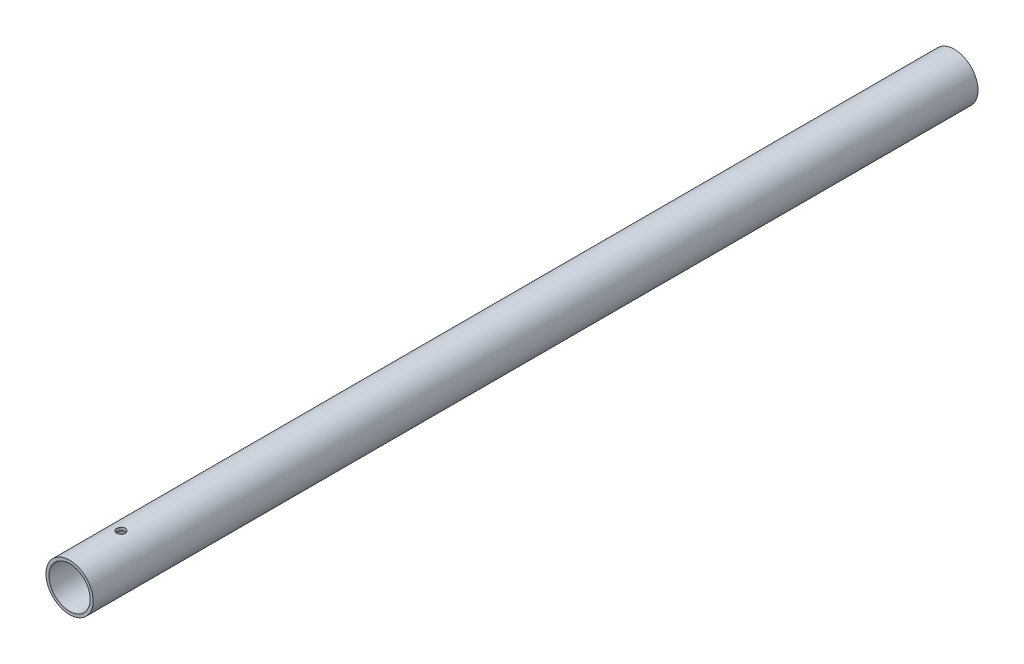
ISO-10303-21;
HEADER;
FILE_DESCRIPTION(('STEP AP214'),'2;1');
FILE_NAME('part.step','',(''),(''),'','','');
FILE_SCHEMA(('AUTOMOTIVE_DESIGN { 1 0 10303 214 1 1 1 1 }'));
ENDSEC;
DATA;
#1=APPLICATION_CONTEXT('core data for automotive mechanical design processes');
#2=APPLICATION_PROTOCOL_DEFINITION('international standard','automotive_design',2000,#1);
#3=PRODUCT_CONTEXT('',#1,'mechanical');
#4=PRODUCT('Part','Part','',(#3));
#5=PRODUCT_RELATED_PRODUCT_CATEGORY('part','',(#4));
#6=PRODUCT_DEFINITION_FORMATION('','',#4);
#7=PRODUCT_DEFINITION_CONTEXT('part definition',#1,'design');
#8=PRODUCT_DEFINITION('design','',#6,#7);
#9=PRODUCT_DEFINITION_SHAPE('','',#8);
#10=(LENGTH_UNIT() NAMED_UNIT(*) SI_UNIT(.MILLI.,.METRE.));
#11=(NAMED_UNIT(*) PLANE_ANGLE_UNIT() SI_UNIT($,.RADIAN.));
#12=(NAMED_UNIT(*) SI_UNIT($,.STERADIAN.) SOLID_ANGLE_UNIT());
#13=UNCERTAINTY_MEASURE_WITH_UNIT(LENGTH_MEASURE(1.E-05),#10,'distance_accuracy_value','');
#14=(GEOMETRIC_REPRESENTATION_CONTEXT(3) GLOBAL_UNCERTAINTY_ASSIGNED_CONTEXT((#13)) GLOBAL_UNIT_ASSIGNED_CONTEXT((#10,
#11,#12)) REPRESENTATION_CONTEXT('',''));
#15=CARTESIAN_POINT('',(0.,0.,0.));
#16=DIRECTION('',(0.,0.,1.));
#17=DIRECTION('',(1.,0.,0.));
#18=AXIS2_PLACEMENT_3D('',#15,#16,#17);
#19=CARTESIAN_POINT('',(0.,0.,300.));
#20=DIRECTION('',(0.,0.,1.));
#21=DIRECTION('',(1.,0.,0.));
#22=AXIS2_PLACEMENT_3D('',#19,#20,#21);
#23=PLANE('',#22);
#24=CARTESIAN_POINT('',(0.,0.,300.));
#25=DIRECTION('',(0.,0.,1.));
#26=DIRECTION('',(1.,0.,0.));
#27=AXIS2_PLACEMENT_3D('',#24,#25,#26);
#28=CIRCLE('',#27,8.);
#29=CARTESIAN_POINT('',(8.,0.,300.));
#30=VERTEX_POINT('',#29);
#31=EDGE_CURVE('E57',#30,#30,#28,.T.);
#32=ORIENTED_EDGE('',*,*,#31,.T.);
#33=EDGE_LOOP('',(#32));
#34=FACE_BOUND('',#33,.T.);
#35=CARTESIAN_POINT('',(0.,0.,300.));
#36=DIRECTION('',(0.,0.,1.));
#37=DIRECTION('',(1.,0.,0.));
#38=AXIS2_PLACEMENT_3D('',#35,#36,#37);
#39=CIRCLE('',#38,7.);
#40=CARTESIAN_POINT('',(7.,0.,300.));
#41=VERTEX_POINT('',#40);
#42=EDGE_CURVE('E96',#41,#41,#39,.T.);
#43=ORIENTED_EDGE('',*,*,#42,.F.);
#44=EDGE_LOOP('',(#43));
#45=FACE_BOUND('',#44,.T.);
#46=ADVANCED_FACE('F39',(#34,#45),#23,.T.);
#47=CARTESIAN_POINT('',(0.,0.,0.));
#48=DIRECTION('',(0.,0.,1.));
#49=DIRECTION('',(1.,0.,0.));
#50=AXIS2_PLACEMENT_3D('',#47,#48,#49);
#51=PLANE('',#50);
#52=CARTESIAN_POINT('',(0.,0.,0.));
#53=DIRECTION('',(0.,0.,1.));
#54=DIRECTION('',(1.,0.,0.));
#55=AXIS2_PLACEMENT_3D('',#52,#53,#54);
#56=CIRCLE('',#55,8.);
#57=CARTESIAN_POINT('',(8.,0.,0.));
#58=VERTEX_POINT('',#57);
#59=EDGE_CURVE('E62',#58,#58,#56,.T.);
#60=ORIENTED_EDGE('',*,*,#59,.F.);
#61=EDGE_LOOP('',(#60));
#62=FACE_BOUND('',#61,.T.);
#63=CARTESIAN_POINT('',(0.,0.,0.));
#64=DIRECTION('',(0.,0.,1.));
#65=DIRECTION('',(1.,0.,0.));
#66=AXIS2_PLACEMENT_3D('',#63,#64,#65);
#67=CIRCLE('',#66,7.);
#68=CARTESIAN_POINT('',(7.,0.,0.));
#69=VERTEX_POINT('',#68);
#70=EDGE_CURVE('E95',#69,#69,#67,.T.);
#71=ORIENTED_EDGE('',*,*,#70,.T.);
#72=EDGE_LOOP('',(#71));
#73=FACE_BOUND('',#72,.T.);
#74=ADVANCED_FACE('F104',(#62,#73),#51,.F.);
#75=CARTESIAN_POINT('',(0.,0.,300.));
#76=DIRECTION('',(0.,0.,-1.));
#77=DIRECTION('',(-1.,0.,0.));
#78=AXIS2_PLACEMENT_3D('',#75,#76,#77);
#79=CYLINDRICAL_SURFACE('',#78,8.);
#80=CARTESIAN_POINT('',(0.,-8.,284.05));
#81=CARTESIAN_POINT('',(0.0807384168234227,-7.99999855711492,284.049996864394));
#82=CARTESIAN_POINT('',(0.161518203029464,-7.99876509049859,284.043233739353));
#83=CARTESIAN_POINT('',(0.320804782772893,-7.9939633998169,284.016375421471));
#84=CARTESIAN_POINT('',(0.399309542630493,-7.99039315024603,283.99626866226));
#85=CARTESIAN_POINT('',(0.551719111767331,-7.98131760656955,283.943356221937));
#86=CARTESIAN_POINT('',(0.62562788827448,-7.97581400939515,283.910561674557));
#87=CARTESIAN_POINT('',(0.766886478728523,-7.96347404674392,283.833235435557));
#88=CARTESIAN_POINT('',(0.834236890617204,-7.9566378029386,283.788704815316));
#89=CARTESIAN_POINT('',(0.961230528069861,-7.94230232780297,283.688639557807));
#90=CARTESIAN_POINT('',(1.02078947767733,-7.93479712298762,283.632998809827));
#91=CARTESIAN_POINT('',(1.12978079245367,-7.92001437127186,283.512521047));
#92=CARTESIAN_POINT('',(1.17921245876536,-7.91273684011195,283.44768339802));
#93=CARTESIAN_POINT('',(1.26689260060321,-7.89917544937294,283.310061889721));
#94=CARTESIAN_POINT('',(1.30505608656449,-7.89289929776914,283.237223056418));
#95=CARTESIAN_POINT('',(1.36857266110055,-7.88213507076236,283.086035293155));
#96=CARTESIAN_POINT('',(1.39392677892338,-7.87764685170301,283.007686806478));
#97=CARTESIAN_POINT('',(1.43083595475152,-7.87102659917878,282.848602985755));
#98=CARTESIAN_POINT('',(1.44253754065478,-7.86886956478164,282.767902708501));
#99=CARTESIAN_POINT('',(1.4522641471114,-7.86708046082951,282.60565762305));
#100=CARTESIAN_POINT('',(1.45029031293551,-7.86744817983484,282.524112886145));
#101=CARTESIAN_POINT('',(1.43284109082216,-7.87064425220334,282.363550316091));
#102=CARTESIAN_POINT('',(1.41753168809445,-7.87344235385139,282.284513753699));
#103=CARTESIAN_POINT('',(1.37410702319918,-7.88113645094699,282.130149817965));
#104=CARTESIAN_POINT('',(1.34599124934181,-7.88603253022063,282.054822592966));
#105=CARTESIAN_POINT('',(1.27758777101004,-7.8974028718839,281.909526431677));
#106=CARTESIAN_POINT('',(1.2372324526172,-7.90388586131609,281.839590038219));
#107=CARTESIAN_POINT('',(1.14554329981398,-7.91769369687744,281.707418820283));
#108=CARTESIAN_POINT('',(1.09420842202846,-7.92501862298427,281.645184728632));
#109=CARTESIAN_POINT('',(0.981119488893061,-7.93981716356006,281.529225125709));
#110=CARTESIAN_POINT('',(0.919223320820373,-7.947291380577,281.475638189518));
#111=CARTESIAN_POINT('',(0.787245929686067,-7.96144718346701,281.379588325244));
#112=CARTESIAN_POINT('',(0.717164634446775,-7.96812876234942,281.337125495266));
#113=CARTESIAN_POINT('',(0.570666241716283,-7.97995863477376,281.264511242861));
#114=CARTESIAN_POINT('',(0.494242189626404,-7.98510521608114,281.234373554887));
#115=CARTESIAN_POINT('',(0.337302535747967,-7.99327184080502,281.187401585601));
#116=CARTESIAN_POINT('',(0.256787340526234,-7.99629209508878,281.170565985105));
#117=CARTESIAN_POINT('',(0.095143815028628,-7.99983699102841,281.150867403795));
#118=CARTESIAN_POINT('',(0.0140393560781089,-8.00039556220426,281.147814441659));
#119=CARTESIAN_POINT('',(-0.147521420048101,-7.99904763243993,281.155259163238));
#120=CARTESIAN_POINT('',(-0.227977766730015,-7.997141244366,281.16575622652));
#121=CARTESIAN_POINT('',(-0.385360780150288,-7.99109868648559,281.199845044508));
#122=CARTESIAN_POINT('',(-0.462308807440198,-7.98697878218855,281.223341314542));
#123=CARTESIAN_POINT('',(-0.611173476743302,-7.97696921908575,281.282658725234));
#124=CARTESIAN_POINT('',(-0.683089794550452,-7.97107944637202,281.318480659186));
#125=CARTESIAN_POINT('',(-0.820664915616791,-7.95809888753131,281.401857579231));
#126=CARTESIAN_POINT('',(-0.886251746357825,-7.95099637108971,281.449529459835));
#127=CARTESIAN_POINT('',(-1.00856278067931,-7.93640989650367,281.555094055752));
#128=CARTESIAN_POINT('',(-1.06528621373945,-7.92892590527148,281.612987658737));
#129=CARTESIAN_POINT('',(-1.16897670385415,-7.91430829115979,281.738209974989));
#130=CARTESIAN_POINT('',(-1.21581450012393,-7.90718014246468,281.805646466398));
#131=CARTESIAN_POINT('',(-1.29749725361189,-7.89418891323489,281.94754185664));
#132=CARTESIAN_POINT('',(-1.33234263775491,-7.8883257876687,282.022000505366));
#133=CARTESIAN_POINT('',(-1.38886500670449,-7.87857082899044,282.175488093918));
#134=CARTESIAN_POINT('',(-1.41060282081407,-7.87466990395996,282.254494028562));
#135=CARTESIAN_POINT('',(-1.44048187516075,-7.86925959519111,282.415113610352));
#136=CARTESIAN_POINT('',(-1.44862453791815,-7.86774996124231,282.49672698376));
#137=CARTESIAN_POINT('',(-1.45103699837205,-7.86730526599662,282.658951287718));
#138=CARTESIAN_POINT('',(-1.44551054413901,-7.86833239212088,282.7395591557));
#139=CARTESIAN_POINT('',(-1.42118600391508,-7.87276194454811,282.898676969441));
#140=CARTESIAN_POINT('',(-1.40238798517159,-7.87616435881542,282.977186925826));
#141=CARTESIAN_POINT('',(-1.35213747052832,-7.88494567612137,283.129780288556));
#142=CARTESIAN_POINT('',(-1.32070563533443,-7.89032135095005,283.203870696323));
#143=CARTESIAN_POINT('',(-1.24610154534254,-7.90244600960305,283.34575921494));
#144=CARTESIAN_POINT('',(-1.2029285368857,-7.90919508157792,283.413556921489));
#145=CARTESIAN_POINT('',(-1.10535337918192,-7.92342424931987,283.541958915034));
#146=CARTESIAN_POINT('',(-1.05080242837475,-7.93091325960403,283.602449155447));
#147=CARTESIAN_POINT('',(-0.93233141624773,-7.94571044164199,283.713485662655));
#148=CARTESIAN_POINT('',(-0.868409203847938,-7.95301857142509,283.764029640128));
#149=CARTESIAN_POINT('',(-0.732373457191765,-7.96670175025597,283.854129856623));
#150=CARTESIAN_POINT('',(-0.660196116623759,-7.97306851844026,283.893591047159));
#151=CARTESIAN_POINT('',(-0.510146088074328,-7.98407092348129,283.959765156424));
#152=CARTESIAN_POINT('',(-0.432278933836096,-7.98870821626546,283.986490276456));
#153=CARTESIAN_POINT('',(-0.295132428700114,-7.99476282370486,284.020889586063));
#154=CARTESIAN_POINT('',(-0.236664063218219,-7.99671586095906,284.031787706975));
#155=CARTESIAN_POINT('',(-0.118804585232492,-7.99933496541903,284.04634398563));
#156=CARTESIAN_POINT('',(-0.0594134936670531,-8.00000106178505,284.050002307418));
#157=CARTESIAN_POINT('',(0.,-8.,284.05));
#158=B_SPLINE_CURVE_WITH_KNOTS('',3,(#80,#81,#82,#83,#84,#85,#86,#87,#88,#89,#90,#91,#92,#93,
#94,#95,#96,#97,#98,#99,#100,#101,#102,#103,#104,#105,#106,#107,#108,#109,#110,#111,#112,#113,
#114,#115,#116,#117,#118,#119,#120,#121,#122,#123,#124,#125,#126,#127,#128,#129,#130,#131,#132,
#133,#134,#135,#136,#137,#138,#139,#140,#141,#142,#143,#144,#145,#146,#147,#148,#149,#150,#151,
#152,#153,#154,#155,#156,#157),.UNSPECIFIED.,.T.,.F.,(4,2,2,2,2,2,2,2,2,2,2,2,2,2,2,2,2,2,2,2,2,
2,2,2,2,2,2,2,2,2,2,2,2,2,2,2,2,2,4),(0.,0.241998005083904,0.484206050469171,0.726202034835234,
0.968175935150463,1.21258210508712,1.4570051351739,1.70322719237314,1.94942946218774,
2.19296428672088,2.43647871627251,2.67700479284047,2.91754048068238,3.15942992047404,
3.40134235696741,3.64681209460557,3.89228399699603,4.13802869911063,4.3837490273581,
4.62607176898316,4.8683834154572,5.10893836825512,5.34950880638363,5.59255371621671,
5.83561974289251,6.08169020422235,6.32775190464074,6.57266271856356,6.81754790478774,
7.05880495959785,7.30006079196019,7.54092368157351,7.78180203568166,8.02605402091782,
8.2703621598073,8.51670566292769,8.76281268933123,8.94089733977538,9.11897795502867),.UNSPECIFIED.);
#159=CARTESIAN_POINT('',(0.,-8.,284.05));
#160=VERTEX_POINT('',#159);
#161=EDGE_CURVE('E10',#160,#160,#158,.T.);
#162=ORIENTED_EDGE('',*,*,#161,.T.);
#163=EDGE_LOOP('',(#162));
#164=FACE_BOUND('',#163,.T.);
#165=CARTESIAN_POINT('',(0.,8.,284.05));
#166=CARTESIAN_POINT('',(-0.0807384168234225,7.99999855711492,284.049996864394));
#167=CARTESIAN_POINT('',(-0.161518203029464,7.99876509049859,284.043233739353));
#168=CARTESIAN_POINT('',(-0.320804782772893,7.9939633998169,284.016375421471));
#169=CARTESIAN_POINT('',(-0.399309542630495,7.99039315024603,283.99626866226));
#170=CARTESIAN_POINT('',(-0.551719111767323,7.98131760656955,283.943356221937));
#171=CARTESIAN_POINT('',(-0.625627888274462,7.97581400939515,283.910561674557));
#172=CARTESIAN_POINT('',(-0.766886478728507,7.96347404674393,283.833235435557));
#173=CARTESIAN_POINT('',(-0.834236890617197,7.9566378029386,283.788704815316));
#174=CARTESIAN_POINT('',(-0.961230528069862,7.94230232780297,283.688639557807));
#175=CARTESIAN_POINT('',(-1.02078947767733,7.93479712298762,283.632998809827));
#176=CARTESIAN_POINT('',(-1.12978079245367,7.92001437127186,283.512521047));
#177=CARTESIAN_POINT('',(-1.17921245876536,7.91273684011195,283.44768339802));
#178=CARTESIAN_POINT('',(-1.26689260060321,7.89917544937294,283.310061889721));
#179=CARTESIAN_POINT('',(-1.30505608656449,7.89289929776914,283.237223056418));
#180=CARTESIAN_POINT('',(-1.36857266110055,7.88213507076237,283.086035293155));
#181=CARTESIAN_POINT('',(-1.39392677892338,7.87764685170301,283.007686806478));
#182=CARTESIAN_POINT('',(-1.43083595475152,7.87102659917878,282.848602985755));
#183=CARTESIAN_POINT('',(-1.44253754065478,7.86886956478164,282.767902708501));
#184=CARTESIAN_POINT('',(-1.4522641471114,7.86708046082951,282.60565762305));
#185=CARTESIAN_POINT('',(-1.45029031293551,7.86744817983483,282.524112886145));
#186=CARTESIAN_POINT('',(-1.43284109082216,7.87064425220334,282.363550316091));
#187=CARTESIAN_POINT('',(-1.41753168809445,7.87344235385139,282.284513753699));
#188=CARTESIAN_POINT('',(-1.37410702319918,7.88113645094699,282.130149817965));
#189=CARTESIAN_POINT('',(-1.34599124934181,7.88603253022063,282.054822592966));
#190=CARTESIAN_POINT('',(-1.27758777101004,7.8974028718839,281.909526431677));
#191=CARTESIAN_POINT('',(-1.2372324526172,7.90388586131609,281.839590038219));
#192=CARTESIAN_POINT('',(-1.14554329981398,7.91769369687744,281.707418820283));
#193=CARTESIAN_POINT('',(-1.09420842202846,7.92501862298427,281.645184728632));
#194=CARTESIAN_POINT('',(-0.981119488893061,7.93981716356006,281.529225125709));
#195=CARTESIAN_POINT('',(-0.919223320820373,7.947291380577,281.475638189518));
#196=CARTESIAN_POINT('',(-0.787245929686067,7.96144718346701,281.379588325244));
#197=CARTESIAN_POINT('',(-0.717164634446775,7.96812876234942,281.337125495266));
#198=CARTESIAN_POINT('',(-0.570666241716283,7.97995863477376,281.264511242861));
#199=CARTESIAN_POINT('',(-0.494242189626404,7.98510521608114,281.234373554887));
#200=CARTESIAN_POINT('',(-0.337302535747967,7.99327184080502,281.187401585601));
#201=CARTESIAN_POINT('',(-0.256787340526234,7.99629209508878,281.170565985105));
#202=CARTESIAN_POINT('',(-0.0951438150286283,7.99983699102841,281.150867403795));
#203=CARTESIAN_POINT('',(-0.0140393560781091,8.00039556220426,281.147814441659));
#204=CARTESIAN_POINT('',(0.147521420048101,7.99904763243993,281.155259163238));
#205=CARTESIAN_POINT('',(0.227977766730015,7.997141244366,281.16575622652));
#206=CARTESIAN_POINT('',(0.385360780150288,7.99109868648559,281.199845044508));
#207=CARTESIAN_POINT('',(0.462308807440198,7.98697878218855,281.223341314542));
#208=CARTESIAN_POINT('',(0.611173476743302,7.97696921908575,281.282658725234));
#209=CARTESIAN_POINT('',(0.683089794550452,7.97107944637202,281.318480659186));
#210=CARTESIAN_POINT('',(0.820664915616791,7.95809888753131,281.401857579231));
#211=CARTESIAN_POINT('',(0.886251746357825,7.95099637108971,281.449529459835));
#212=CARTESIAN_POINT('',(1.00856278067931,7.93640989650367,281.555094055752));
#213=CARTESIAN_POINT('',(1.06528621373945,7.92892590527148,281.612987658737));
#214=CARTESIAN_POINT('',(1.16897670385415,7.91430829115979,281.738209974989));
#215=CARTESIAN_POINT('',(1.21581450012393,7.90718014246468,281.805646466398));
#216=CARTESIAN_POINT('',(1.29749725361189,7.89418891323489,281.94754185664));
#217=CARTESIAN_POINT('',(1.33234263775491,7.8883257876687,282.022000505366));
#218=CARTESIAN_POINT('',(1.38886500670449,7.87857082899044,282.175488093918));
#219=CARTESIAN_POINT('',(1.41060282081407,7.87466990395996,282.254494028562));
#220=CARTESIAN_POINT('',(1.44048187516075,7.86925959519111,282.415113610352));
#221=CARTESIAN_POINT('',(1.44862453791815,7.86774996124231,282.49672698376));
#222=CARTESIAN_POINT('',(1.45103699837205,7.86730526599662,282.658951287718));
#223=CARTESIAN_POINT('',(1.44551054413901,7.86833239212088,282.7395591557));
#224=CARTESIAN_POINT('',(1.42118600391508,7.87276194454811,282.898676969441));
#225=CARTESIAN_POINT('',(1.40238798517159,7.87616435881542,282.977186925826));
#226=CARTESIAN_POINT('',(1.35213747052832,7.88494567612137,283.129780288556));
#227=CARTESIAN_POINT('',(1.32070563533443,7.89032135095005,283.203870696323));
#228=CARTESIAN_POINT('',(1.24610154534254,7.90244600960305,283.34575921494));
#229=CARTESIAN_POINT('',(1.2029285368857,7.90919508157792,283.413556921489));
#230=CARTESIAN_POINT('',(1.10535337918192,7.92342424931987,283.541958915034));
#231=CARTESIAN_POINT('',(1.05080242837475,7.93091325960403,283.602449155447));
#232=CARTESIAN_POINT('',(0.93233141624773,7.94571044164199,283.713485662655));
#233=CARTESIAN_POINT('',(0.868409203847938,7.95301857142509,283.764029640128));
#234=CARTESIAN_POINT('',(0.732373457191765,7.96670175025597,283.854129856623));
#235=CARTESIAN_POINT('',(0.660196116623759,7.97306851844026,283.893591047159));
#236=CARTESIAN_POINT('',(0.510146088074328,7.98407092348129,283.959765156424));
#237=CARTESIAN_POINT('',(0.432278933836096,7.98870821626546,283.986490276456));
#238=CARTESIAN_POINT('',(0.295132428700114,7.99476282370485,284.020889586063));
#239=CARTESIAN_POINT('',(0.236664063218219,7.99671586095906,284.031787706975));
#240=CARTESIAN_POINT('',(0.118804585232492,7.99933496541903,284.04634398563));
#241=CARTESIAN_POINT('',(0.059413493667053,8.00000106178505,284.050002307418));
#242=CARTESIAN_POINT('',(0.,8.,284.05));
#243=B_SPLINE_CURVE_WITH_KNOTS('',3,(#165,#166,#167,#168,#169,#170,#171,#172,#173,#174,#175,
#176,#177,#178,#179,#180,#181,#182,#183,#184,#185,#186,#187,#188,#189,#190,#191,#192,#193,#194,
#195,#196,#197,#198,#199,#200,#201,#202,#203,#204,#205,#206,#207,#208,#209,#210,#211,#212,#213,
#214,#215,#216,#217,#218,#219,#220,#221,#222,#223,#224,#225,#226,#227,#228,#229,#230,#231,#232,
#233,#234,#235,#236,#237,#238,#239,#240,#241,#242),.UNSPECIFIED.,.T.,.F.,(4,2,2,2,2,2,2,2,2,2,2,
2,2,2,2,2,2,2,2,2,2,2,2,2,2,2,2,2,2,2,2,2,2,2,2,2,2,2,4),(0.,0.241998005083904,
0.484206050469171,0.726202034835212,0.968175935150461,1.21258210508712,1.45700513517389,
1.70322719237314,1.94942946218774,2.19296428672088,2.43647871627251,2.67700479284047,
2.91754048068238,3.15942992047403,3.40134235696741,3.64681209460557,3.89228399699602,
4.13802869911063,4.3837490273581,4.62607176898316,4.8683834154572,5.10893836825512,
5.34950880638363,5.5925537162167,5.83561974289251,6.08169020422235,6.32775190464074,
6.57266271856356,6.81754790478774,7.05880495959785,7.30006079196019,7.54092368157351,
7.78180203568165,8.02605402091782,8.27036215980729,8.51670566292768,8.76281268933123,
8.94089733977538,9.11897795502867),.UNSPECIFIED.);
#244=CARTESIAN_POINT('',(0.,8.,284.05));
#245=VERTEX_POINT('',#244);
#246=EDGE_CURVE('E52',#245,#245,#243,.T.);
#247=ORIENTED_EDGE('',*,*,#246,.T.);
#248=EDGE_LOOP('',(#247));
#249=FACE_BOUND('',#248,.T.);
#250=ORIENTED_EDGE('',*,*,#31,.F.);
#251=EDGE_LOOP('',(#250));
#252=FACE_BOUND('',#251,.T.);
#253=ORIENTED_EDGE('',*,*,#59,.T.);
#254=EDGE_LOOP('',(#253));
#255=FACE_BOUND('',#254,.T.);
#256=ADVANCED_FACE('F41',(#164,#249,#252,#255),#79,.T.);
#257=CARTESIAN_POINT('',(0.,0.,300.));
#258=DIRECTION('',(0.,0.,-1.));
#259=DIRECTION('',(-1.,0.,0.));
#260=AXIS2_PLACEMENT_3D('',#257,#258,#259);
#261=CYLINDRICAL_SURFACE('',#260,7.);
#262=CARTESIAN_POINT('',(0.,-7.,284.05));
#263=CARTESIAN_POINT('',(0.0805249466701699,-6.99999850989255,284.049997112581));
#264=CARTESIAN_POINT('',(0.161085782822646,-6.99859630536539,284.043269478559));
#265=CARTESIAN_POINT('',(0.31992617344772,-6.99313795170365,284.016560500689));
#266=CARTESIAN_POINT('',(0.398203935415156,-6.98907977292524,283.996569020708));
#267=CARTESIAN_POINT('',(0.55015901736692,-6.97876214021718,283.943979778004));
#268=CARTESIAN_POINT('',(0.623840809310501,-6.97250486666568,283.911394498715));
#269=CARTESIAN_POINT('',(0.764687319545304,-6.95846744810608,283.834580684827));
#270=CARTESIAN_POINT('',(0.831852343480726,-6.95068737457082,283.790352696647));
#271=CARTESIAN_POINT('',(0.958735191224268,-6.93433322717969,283.690830625646));
#272=CARTESIAN_POINT('',(1.0183451170875,-6.92575016331789,283.635400445721));
#273=CARTESIAN_POINT('',(1.12749089757001,-6.90882203110262,283.515339874854));
#274=CARTESIAN_POINT('',(1.17702592540149,-6.90047698232993,283.450708729582));
#275=CARTESIAN_POINT('',(1.26508129339265,-6.8848816514879,283.313296686548));
#276=CARTESIAN_POINT('',(1.30348874148085,-6.87764291962182,283.240442018846));
#277=CARTESIAN_POINT('',(1.36747513943071,-6.86520802025398,283.089138410899));
#278=CARTESIAN_POINT('',(1.39305545463205,-6.8600116353744,283.010690067069));
#279=CARTESIAN_POINT('',(1.43030881956003,-6.85234097622929,282.85159046977));
#280=CARTESIAN_POINT('',(1.44217182957258,-6.84982955771594,282.770985523768));
#281=CARTESIAN_POINT('',(1.45224410561838,-6.84770147594288,282.608893308868));
#282=CARTESIAN_POINT('',(1.45045487179047,-6.84808449463592,282.527406137892));
#283=CARTESIAN_POINT('',(1.43342676821931,-6.85166830695804,282.367260642511));
#284=CARTESIAN_POINT('',(1.41840673311629,-6.85482325133795,282.28857786967));
#285=CARTESIAN_POINT('',(1.37568928712309,-6.86352313010211,282.134873722447));
#286=CARTESIAN_POINT('',(1.34799123125568,-6.86906818607924,282.059852534557));
#287=CARTESIAN_POINT('',(1.28049802870707,-6.88196974503289,281.914976232658));
#288=CARTESIAN_POINT('',(1.24061711070686,-6.88933901897796,281.845162261224));
#289=CARTESIAN_POINT('',(1.14995069533808,-6.90505062197315,281.713135705791));
#290=CARTESIAN_POINT('',(1.09916385767282,-6.91339307056518,281.650924057564));
#291=CARTESIAN_POINT('',(0.986960509081247,-6.9303089640358,281.534606412996));
#292=CARTESIAN_POINT('',(0.925357477228381,-6.93888375665344,281.480680375497));
#293=CARTESIAN_POINT('',(0.793887705276948,-6.95515079073521,281.383897606444));
#294=CARTESIAN_POINT('',(0.724020843915681,-6.9628430192454,281.341041037352));
#295=CARTESIAN_POINT('',(0.577799452871655,-6.97649928617586,281.267576333351));
#296=CARTESIAN_POINT('',(0.501433722610628,-6.98246025951923,281.236989885859));
#297=CARTESIAN_POINT('',(0.344496338824663,-6.99195931104416,281.189131542233));
#298=CARTESIAN_POINT('',(0.263925234033304,-6.99549770448695,281.171857913605));
#299=CARTESIAN_POINT('',(0.102409617414456,-6.99970865003273,281.151372906149));
#300=CARTESIAN_POINT('',(0.0214975875215036,-7.00043135195801,281.147915421317));
#301=CARTESIAN_POINT('',(-0.139747949683111,-6.99906924098975,281.154496469249));
#302=CARTESIAN_POINT('',(-0.220081491699673,-6.99698459795039,281.164534185505));
#303=CARTESIAN_POINT('',(-0.377087744537933,-6.99027351051101,281.19761636639));
#304=CARTESIAN_POINT('',(-0.453788440468325,-6.98567195905928,281.220533509809));
#305=CARTESIAN_POINT('',(-0.60225802799353,-6.97444143082262,281.278584068339));
#306=CARTESIAN_POINT('',(-0.674026530001091,-6.9678122941064,281.313718447147));
#307=CARTESIAN_POINT('',(-0.811624905536874,-6.95313741331486,281.395731234301));
#308=CARTESIAN_POINT('',(-0.877365373532025,-6.94507436179468,281.442756480674));
#309=CARTESIAN_POINT('',(-1.00011039343952,-6.92846465129707,281.547020737622));
#310=CARTESIAN_POINT('',(-1.05711393417321,-6.91991793649879,281.60426092878));
#311=CARTESIAN_POINT('',(-1.16172548521281,-6.9031335571035,281.728454052886));
#312=CARTESIAN_POINT('',(-1.20916397857029,-6.89490326481206,281.795550948034));
#313=CARTESIAN_POINT('',(-1.29209855284092,-6.87984485462705,281.936904930298));
#314=CARTESIAN_POINT('',(-1.32759512839163,-6.87301667866201,282.011161720684));
#315=CARTESIAN_POINT('',(-1.38541225144555,-6.86159619967506,282.164342712475));
#316=CARTESIAN_POINT('',(-1.40780354188464,-6.85699191600111,282.243239276049));
#317=CARTESIAN_POINT('',(-1.43898654508072,-6.8505164725203,282.40378133795));
#318=CARTESIAN_POINT('',(-1.44778017803992,-6.84864492681012,282.485426446474));
#319=CARTESIAN_POINT('',(-1.45144317482413,-6.8478693742264,282.647443435895));
#320=CARTESIAN_POINT('',(-1.44658072353374,-6.84890821084664,282.727809098415));
#321=CARTESIAN_POINT('',(-1.4236643144385,-6.85370808819984,282.886549951205));
#322=CARTESIAN_POINT('',(-1.40561048016885,-6.85746910344004,282.964925160109));
#323=CARTESIAN_POINT('',(-1.35694717999705,-6.86726314204613,283.117273920146));
#324=CARTESIAN_POINT('',(-1.32637288978757,-6.87328979633686,283.191259143374));
#325=CARTESIAN_POINT('',(-1.25356831928483,-6.88693924841348,283.333091021051));
#326=CARTESIAN_POINT('',(-1.21133697195812,-6.89456219230097,283.400937112796));
#327=CARTESIAN_POINT('',(-1.11551093086308,-6.91071865839384,283.529895325694));
#328=CARTESIAN_POINT('',(-1.06172349364357,-6.91926622289806,283.590862490863));
#329=CARTESIAN_POINT('',(-0.944707390741378,-6.93621049582109,283.702994024384));
#330=CARTESIAN_POINT('',(-0.881476555137309,-6.94460716906972,283.754156133526));
#331=CARTESIAN_POINT('',(-0.74650312719802,-6.96041647836585,283.845777828524));
#332=CARTESIAN_POINT('',(-0.674671893506791,-6.96781683427348,283.886109050595));
#333=CARTESIAN_POINT('',(-0.525115847154295,-6.9806780457368,283.954063177525));
#334=CARTESIAN_POINT('',(-0.447396280793941,-6.98614060370609,283.981697243549));
#335=CARTESIAN_POINT('',(-0.307947357021847,-6.99348144016889,284.018278172815));
#336=CARTESIAN_POINT('',(-0.246997868022784,-6.99591128786898,284.030152105512));
#337=CARTESIAN_POINT('',(-0.124039325999859,-6.99917111277284,284.046013988557));
#338=CARTESIAN_POINT('',(-0.0620303113968005,-7.00000114786576,284.050002224248));
#339=CARTESIAN_POINT('',(0.,-7.,284.05));
#340=B_SPLINE_CURVE_WITH_KNOTS('',3,(#262,#263,#264,#265,#266,#267,#268,#269,#270,#271,#272,
#273,#274,#275,#276,#277,#278,#279,#280,#281,#282,#283,#284,#285,#286,#287,#288,#289,#290,#291,
#292,#293,#294,#295,#296,#297,#298,#299,#300,#301,#302,#303,#304,#305,#306,#307,#308,#309,#310,
#311,#312,#313,#314,#315,#316,#317,#318,#319,#320,#321,#322,#323,#324,#325,#326,#327,#328,#329,
#330,#331,#332,#333,#334,#335,#336,#337,#338,#339),.UNSPECIFIED.,.T.,.F.,(4,2,2,2,2,2,2,2,2,2,2,
2,2,2,2,2,2,2,2,2,2,2,2,2,2,2,2,2,2,2,2,2,2,2,2,2,2,2,4),(0.,0.241347866901649,
0.482880382833939,0.724174094429787,0.965456483586399,1.20986854684721,1.45430065948702,
1.70113209748299,1.94793725678247,2.1912820486828,2.4346001017025,2.67396773836071,
2.91334755387888,3.15445311681827,3.39558832770364,3.64138539978137,3.88718607911109,
4.13341931650588,4.37962050436621,4.62141603927576,4.86319694536795,5.10262870680993,
5.34207935895366,5.58464515465516,5.82723900283267,6.07381351285608,6.32037780843728,
6.56559856149928,6.81078468238681,7.05118957615149,7.29159221859151,7.53132404368209,
7.77107782000353,8.01519314503483,8.25936464988256,8.50631366084898,8.75304517925694,
8.9389679983145,9.12488408963691),.UNSPECIFIED.);
#341=CARTESIAN_POINT('',(0.,-7.,284.05));
#342=VERTEX_POINT('',#341);
#343=EDGE_CURVE('E88',#342,#342,#340,.T.);
#344=ORIENTED_EDGE('',*,*,#343,.F.);
#345=EDGE_LOOP('',(#344));
#346=FACE_BOUND('',#345,.T.);
#347=CARTESIAN_POINT('',(0.,7.,284.05));
#348=CARTESIAN_POINT('',(-0.0805249466701699,6.99999850989255,284.049997112581));
#349=CARTESIAN_POINT('',(-0.161085782822646,6.99859630536539,284.043269478559));
#350=CARTESIAN_POINT('',(-0.31992617344772,6.99313795170365,284.016560500689));
#351=CARTESIAN_POINT('',(-0.398203935415156,6.98907977292524,283.996569020708));
#352=CARTESIAN_POINT('',(-0.55015901736692,6.97876214021718,283.943979778004));
#353=CARTESIAN_POINT('',(-0.623840809310501,6.97250486666568,283.911394498715));
#354=CARTESIAN_POINT('',(-0.764687319545304,6.95846744810608,283.834580684827));
#355=CARTESIAN_POINT('',(-0.831852343480726,6.95068737457082,283.790352696647));
#356=CARTESIAN_POINT('',(-0.958735191224268,6.93433322717969,283.690830625646));
#357=CARTESIAN_POINT('',(-1.0183451170875,6.92575016331789,283.635400445721));
#358=CARTESIAN_POINT('',(-1.12749089757001,6.90882203110262,283.515339874854));
#359=CARTESIAN_POINT('',(-1.17702592540149,6.90047698232993,283.450708729582));
#360=CARTESIAN_POINT('',(-1.26508129339265,6.8848816514879,283.313296686548));
#361=CARTESIAN_POINT('',(-1.30348874148085,6.87764291962182,283.240442018846));
#362=CARTESIAN_POINT('',(-1.36747513943071,6.86520802025398,283.089138410899));
#363=CARTESIAN_POINT('',(-1.39305545463205,6.8600116353744,283.010690067069));
#364=CARTESIAN_POINT('',(-1.43030881956003,6.85234097622929,282.85159046977));
#365=CARTESIAN_POINT('',(-1.44217182957258,6.84982955771594,282.770985523768));
#366=CARTESIAN_POINT('',(-1.45224410561838,6.84770147594288,282.608893308868));
#367=CARTESIAN_POINT('',(-1.45045487179047,6.84808449463592,282.527406137892));
#368=CARTESIAN_POINT('',(-1.43342676821931,6.85166830695804,282.367260642511));
#369=CARTESIAN_POINT('',(-1.41840673311629,6.85482325133795,282.28857786967));
#370=CARTESIAN_POINT('',(-1.37568928712309,6.86352313010211,282.134873722447));
#371=CARTESIAN_POINT('',(-1.34799123125568,6.86906818607924,282.059852534557));
#372=CARTESIAN_POINT('',(-1.28049802870707,6.88196974503289,281.914976232658));
#373=CARTESIAN_POINT('',(-1.24061711070686,6.88933901897796,281.845162261224));
#374=CARTESIAN_POINT('',(-1.14995069533808,6.90505062197315,281.713135705791));
#375=CARTESIAN_POINT('',(-1.09916385767282,6.91339307056518,281.650924057564));
#376=CARTESIAN_POINT('',(-0.986960509081247,6.9303089640358,281.534606412996));
#377=CARTESIAN_POINT('',(-0.925357477228381,6.93888375665344,281.480680375497));
#378=CARTESIAN_POINT('',(-0.793887705276948,6.95515079073521,281.383897606444));
#379=CARTESIAN_POINT('',(-0.724020843915681,6.9628430192454,281.341041037352));
#380=CARTESIAN_POINT('',(-0.577799452871655,6.97649928617586,281.267576333351));
#381=CARTESIAN_POINT('',(-0.501433722610628,6.98246025951923,281.236989885859));
#382=CARTESIAN_POINT('',(-0.344496338824663,6.99195931104416,281.189131542233));
#383=CARTESIAN_POINT('',(-0.263925234033304,6.99549770448695,281.171857913605));
#384=CARTESIAN_POINT('',(-0.102409617414456,6.99970865003273,281.151372906149));
#385=CARTESIAN_POINT('',(-0.0214975875215036,7.00043135195801,281.147915421317));
#386=CARTESIAN_POINT('',(0.139747949683111,6.99906924098975,281.154496469249));
#387=CARTESIAN_POINT('',(0.220081491699673,6.99698459795039,281.164534185505));
#388=CARTESIAN_POINT('',(0.377087744537933,6.99027351051101,281.19761636639));
#389=CARTESIAN_POINT('',(0.453788440468325,6.98567195905928,281.220533509809));
#390=CARTESIAN_POINT('',(0.60225802799353,6.97444143082262,281.278584068339));
#391=CARTESIAN_POINT('',(0.674026530001091,6.9678122941064,281.313718447147));
#392=CARTESIAN_POINT('',(0.811624905536874,6.95313741331486,281.395731234301));
#393=CARTESIAN_POINT('',(0.877365373532025,6.94507436179468,281.442756480674));
#394=CARTESIAN_POINT('',(1.00011039343952,6.92846465129707,281.547020737622));
#395=CARTESIAN_POINT('',(1.05711393417321,6.91991793649879,281.60426092878));
#396=CARTESIAN_POINT('',(1.16172548521281,6.9031335571035,281.728454052886));
#397=CARTESIAN_POINT('',(1.20916397857029,6.89490326481206,281.795550948034));
#398=CARTESIAN_POINT('',(1.29209855284092,6.87984485462705,281.936904930298));
#399=CARTESIAN_POINT('',(1.32759512839163,6.87301667866201,282.011161720684));
#400=CARTESIAN_POINT('',(1.38541225144555,6.86159619967506,282.164342712475));
#401=CARTESIAN_POINT('',(1.40780354188464,6.85699191600111,282.243239276049));
#402=CARTESIAN_POINT('',(1.43898654508072,6.8505164725203,282.40378133795));
#403=CARTESIAN_POINT('',(1.44778017803992,6.84864492681012,282.485426446474));
#404=CARTESIAN_POINT('',(1.45144317482413,6.8478693742264,282.647443435895));
#405=CARTESIAN_POINT('',(1.44658072353374,6.84890821084664,282.727809098415));
#406=CARTESIAN_POINT('',(1.4236643144385,6.85370808819984,282.886549951205));
#407=CARTESIAN_POINT('',(1.40561048016885,6.85746910344004,282.964925160109));
#408=CARTESIAN_POINT('',(1.35694717999705,6.86726314204613,283.117273920146));
#409=CARTESIAN_POINT('',(1.32637288978757,6.87328979633686,283.191259143374));
#410=CARTESIAN_POINT('',(1.25356831928483,6.88693924841348,283.333091021051));
#411=CARTESIAN_POINT('',(1.21133697195812,6.89456219230097,283.400937112796));
#412=CARTESIAN_POINT('',(1.11551093086308,6.91071865839384,283.529895325694));
#413=CARTESIAN_POINT('',(1.06172349364357,6.91926622289806,283.590862490863));
#414=CARTESIAN_POINT('',(0.944707390741378,6.93621049582109,283.702994024384));
#415=CARTESIAN_POINT('',(0.881476555137309,6.94460716906972,283.754156133526));
#416=CARTESIAN_POINT('',(0.74650312719802,6.96041647836585,283.845777828524));
#417=CARTESIAN_POINT('',(0.674671893506791,6.96781683427348,283.886109050595));
#418=CARTESIAN_POINT('',(0.525115847154295,6.9806780457368,283.954063177525));
#419=CARTESIAN_POINT('',(0.447396280793941,6.98614060370609,283.981697243549));
#420=CARTESIAN_POINT('',(0.307947357021847,6.99348144016889,284.018278172815));
#421=CARTESIAN_POINT('',(0.246997868022784,6.99591128786898,284.030152105512));
#422=CARTESIAN_POINT('',(0.124039325999859,6.99917111277284,284.046013988557));
#423=CARTESIAN_POINT('',(0.0620303113968005,7.00000114786576,284.050002224248));
#424=CARTESIAN_POINT('',(0.,7.,284.05));
#425=B_SPLINE_CURVE_WITH_KNOTS('',3,(#347,#348,#349,#350,#351,#352,#353,#354,#355,#356,#357,
#358,#359,#360,#361,#362,#363,#364,#365,#366,#367,#368,#369,#370,#371,#372,#373,#374,#375,#376,
#377,#378,#379,#380,#381,#382,#383,#384,#385,#386,#387,#388,#389,#390,#391,#392,#393,#394,#395,
#396,#397,#398,#399,#400,#401,#402,#403,#404,#405,#406,#407,#408,#409,#410,#411,#412,#413,#414,
#415,#416,#417,#418,#419,#420,#421,#422,#423,#424),.UNSPECIFIED.,.T.,.F.,(4,2,2,2,2,2,2,2,2,2,2,
2,2,2,2,2,2,2,2,2,2,2,2,2,2,2,2,2,2,2,2,2,2,2,2,2,2,2,4),(0.,0.241347866901649,
0.482880382833939,0.724174094429787,0.965456483586399,1.20986854684721,1.45430065948702,
1.70113209748299,1.94793725678247,2.1912820486828,2.4346001017025,2.67396773836071,
2.91334755387888,3.15445311681827,3.39558832770364,3.64138539978137,3.88718607911109,
4.13341931650588,4.37962050436621,4.62141603927576,4.86319694536795,5.10262870680993,
5.34207935895366,5.58464515465516,5.82723900283267,6.07381351285608,6.32037780843728,
6.56559856149928,6.81078468238681,7.05118957615149,7.29159221859151,7.53132404368209,
7.77107782000353,8.01519314503483,8.25936464988256,8.50631366084898,8.75304517925694,
8.9389679983145,9.12488408963691),.UNSPECIFIED.);
#426=CARTESIAN_POINT('',(0.,7.,284.05));
#427=VERTEX_POINT('',#426);
#428=EDGE_CURVE('E82',#427,#427,#425,.T.);
#429=ORIENTED_EDGE('',*,*,#428,.F.);
#430=EDGE_LOOP('',(#429));
#431=FACE_BOUND('',#430,.T.);
#432=ORIENTED_EDGE('',*,*,#42,.T.);
#433=EDGE_LOOP('',(#432));
#434=FACE_BOUND('',#433,.T.);
#435=ORIENTED_EDGE('',*,*,#70,.F.);
#436=EDGE_LOOP('',(#435));
#437=FACE_BOUND('',#436,.T.);
#438=ADVANCED_FACE('F74',(#346,#431,#434,#437),#261,.F.);
#439=CARTESIAN_POINT('',(0.,8.,282.6));
#440=DIRECTION('',(0.,1.,0.));
#441=DIRECTION('',(0.,0.,1.));
#442=AXIS2_PLACEMENT_3D('',#439,#440,#441);
#443=CYLINDRICAL_SURFACE('',#442,1.44999999999999);
#444=ORIENTED_EDGE('',*,*,#428,.T.);
#445=EDGE_LOOP('',(#444));
#446=FACE_BOUND('',#445,.T.);
#447=ORIENTED_EDGE('',*,*,#246,.F.);
#448=EDGE_LOOP('',(#447));
#449=FACE_BOUND('',#448,.T.);
#450=ADVANCED_FACE('F72',(#446,#449),#443,.F.);
#451=ORIENTED_EDGE('',*,*,#343,.T.);
#452=EDGE_LOOP('',(#451));
#453=FACE_BOUND('',#452,.T.);
#454=ORIENTED_EDGE('',*,*,#161,.F.);
#455=EDGE_LOOP('',(#454));
#456=FACE_BOUND('',#455,.T.);
#457=ADVANCED_FACE('F68',(#453,#456),#443,.F.);
#458=CLOSED_SHELL('',(#46,#74,#256,#438,#450,#457));
#459=MANIFOLD_SOLID_BREP('B2',#458);
#460=ADVANCED_BREP_SHAPE_REPRESENTATION('',(#18,#459),#14);
#461=SHAPE_DEFINITION_REPRESENTATION(#9,#460);
ENDSEC;
END-ISO-10303-21;
